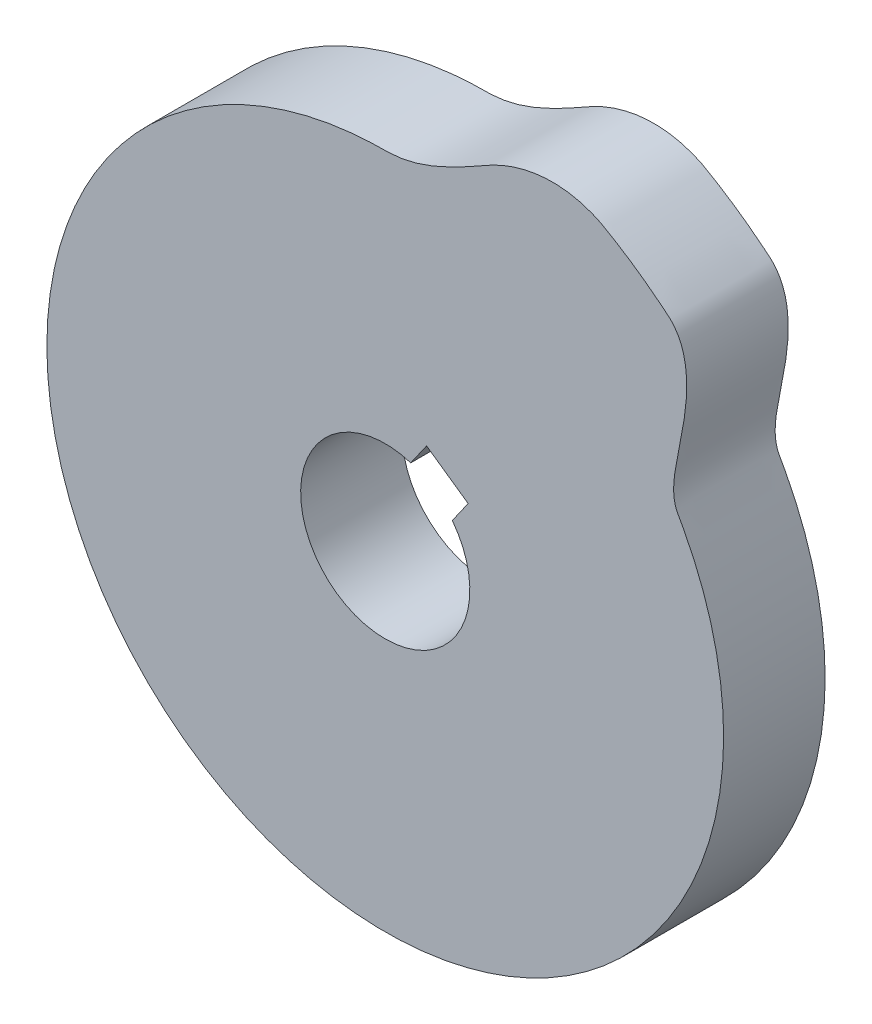
ISO-10303-21;
HEADER;
FILE_DESCRIPTION(('STEP AP214'),'2;1');
FILE_NAME('part.step','',(''),(''),'','','');
FILE_SCHEMA(('AUTOMOTIVE_DESIGN { 1 0 10303 214 1 1 1 1 }'));
ENDSEC;
DATA;
#1=APPLICATION_CONTEXT('core data for automotive mechanical design processes');
#2=APPLICATION_PROTOCOL_DEFINITION('international standard','automotive_design',2000,#1);
#3=PRODUCT_CONTEXT('',#1,'mechanical');
#4=PRODUCT('Part','Part','',(#3));
#5=PRODUCT_RELATED_PRODUCT_CATEGORY('part','',(#4));
#6=PRODUCT_DEFINITION_FORMATION('','',#4);
#7=PRODUCT_DEFINITION_CONTEXT('part definition',#1,'design');
#8=PRODUCT_DEFINITION('design','',#6,#7);
#9=PRODUCT_DEFINITION_SHAPE('','',#8);
#10=(LENGTH_UNIT() NAMED_UNIT(*) SI_UNIT(.MILLI.,.METRE.));
#11=(NAMED_UNIT(*) PLANE_ANGLE_UNIT() SI_UNIT($,.RADIAN.));
#12=(NAMED_UNIT(*) SI_UNIT($,.STERADIAN.) SOLID_ANGLE_UNIT());
#13=UNCERTAINTY_MEASURE_WITH_UNIT(LENGTH_MEASURE(1.E-05),#10,'distance_accuracy_value','');
#14=(GEOMETRIC_REPRESENTATION_CONTEXT(3) GLOBAL_UNCERTAINTY_ASSIGNED_CONTEXT((#13)) GLOBAL_UNIT_ASSIGNED_CONTEXT((#10,
#11,#12)) REPRESENTATION_CONTEXT('',''));
#15=CARTESIAN_POINT('',(0.,0.,0.));
#16=DIRECTION('',(0.,0.,1.));
#17=DIRECTION('',(1.,0.,0.));
#18=AXIS2_PLACEMENT_3D('',#15,#16,#17);
#19=CARTESIAN_POINT('',(-20.4615325185937,-34.3704187782246,12.));
#20=DIRECTION('',(0.,0.,1.));
#21=DIRECTION('',(1.,0.,0.));
#22=AXIS2_PLACEMENT_3D('',#19,#20,#21);
#23=PLANE('',#22);
#24=CARTESIAN_POINT('',(27.351788267644,44.2253284731948,12.));
#25=CARTESIAN_POINT('',(27.1931830429581,44.3234201476609,12.));
#26=CARTESIAN_POINT('',(26.874917235541,44.5178970796033,12.));
#27=CARTESIAN_POINT('',(26.3943448832861,44.8044963702247,12.));
#28=CARTESIAN_POINT('',(26.0719680807481,44.992079947368,12.));
#29=CARTESIAN_POINT('',(25.9102798104762,45.0850019423625,12.));
#30=CARTESIAN_POINT('',(25.7666668137713,45.1675361060252,12.));
#31=CARTESIAN_POINT('',(25.4786521116071,45.3312320461753,12.));
#32=CARTESIAN_POINT('',(25.0263100752025,45.5410170253763,12.));
#33=CARTESIAN_POINT('',(24.7225148507991,45.6733112667028,12.));
#34=CARTESIAN_POINT('',(24.5693142242955,45.7362886359156,12.));
#35=CARTESIAN_POINT('',(24.500615486571,45.7645291586136,12.));
#36=CARTESIAN_POINT('',(24.1486297754229,45.9054195878392,12.));
#37=CARTESIAN_POINT('',(23.4998149017966,46.1301547808238,12.));
#38=CARTESIAN_POINT('',(22.6079561920923,46.3656618421867,12.));
#39=CARTESIAN_POINT('',(21.6925330586667,46.5356784028058,12.));
#40=CARTESIAN_POINT('',(20.7564308154284,46.6390930460574,12.));
#41=CARTESIAN_POINT('',(19.8025690526918,46.6748886771731,12.));
#42=CARTESIAN_POINT('',(18.8338993754837,46.6421490697562,12.));
#43=CARTESIAN_POINT('',(17.853404897449,46.5400524704584,12.));
#44=CARTESIAN_POINT('',(16.8640862755001,46.367892076313,12.));
#45=CARTESIAN_POINT('',(15.8690024660056,46.1249993635437,12.));
#46=CARTESIAN_POINT('',(14.8711012043807,45.8110394708018,12.));
#47=CARTESIAN_POINT('',(13.8738602057386,45.4248740255938,12.));
#48=CARTESIAN_POINT('',(12.8788004550631,44.9689516213643,12.));
#49=CARTESIAN_POINT('',(11.9060560533204,44.4383261847397,12.));
#50=CARTESIAN_POINT('',(10.9563776069495,43.8878865770447,12.));
#51=CARTESIAN_POINT('',(10.0257220609132,43.3714696064802,12.));
#52=CARTESIAN_POINT('',(9.12876985688208,42.8861859173922,12.));
#53=CARTESIAN_POINT('',(8.2615996967004,42.4358063582141,12.));
#54=CARTESIAN_POINT('',(7.42217967019699,42.0207328607829,12.));
#55=CARTESIAN_POINT('',(6.6079609704187,41.6421075590876,12.));
#56=CARTESIAN_POINT('',(5.81648657571885,41.3007815925118,12.));
#57=CARTESIAN_POINT('',(5.04524338817252,40.997575808521,12.));
#58=CARTESIAN_POINT('',(4.29170589369962,40.73321644489,12.));
#59=CARTESIAN_POINT('',(3.55333298391446,40.508352574395,12.));
#60=CARTESIAN_POINT('',(2.82757854480692,40.3235483423924,12.));
#61=CARTESIAN_POINT('',(2.30179887798916,40.2175673720358,12.));
#62=CARTESIAN_POINT('',(2.01871004189042,40.1699451235539,12.));
#63=CARTESIAN_POINT('',(1.97501068572763,40.162820075087,12.));
#64=CARTESIAN_POINT('',(1.52579688274788,40.0895771168543,12.));
#65=CARTESIAN_POINT('',(0.619782199846999,39.9896242701687,12.));
#66=CARTESIAN_POINT('',(-0.751104888086971,40.0007194379671,12.));
#67=CARTESIAN_POINT('',(-1.66094397619508,39.9680925574346,12.));
#68=CARTESIAN_POINT('',(-2.11545267771183,39.9440215798104,12.));
#69=CARTESIAN_POINT('',(-51.8018720926637,37.3126072945147,12.));
#70=CARTESIAN_POINT('',(-62.8505970591826,-11.2012081814256,12.));
#71=CARTESIAN_POINT('',(-19.2036998230267,-35.0887148967739,12.));
#72=CARTESIAN_POINT('',(24.4431974131292,-58.9762216121223,12.));
#73=CARTESIAN_POINT('',(59.3504585177276,-23.5199423714186,12.));
#74=CARTESIAN_POINT('',(34.7847836199959,19.748894361712,12.));
#75=CARTESIAN_POINT('',(34.7538149178673,19.8034411926792,12.));
#76=CARTESIAN_POINT('',(34.6916209051342,19.9123891663799,12.));
#77=CARTESIAN_POINT('',(34.5965626736092,20.0750102148542,12.));
#78=CARTESIAN_POINT('',(34.5393063137751,20.1866822094049,12.));
#79=CARTESIAN_POINT('',(34.512190789136,20.2432433763275,12.));
#80=CARTESIAN_POINT('',(34.3443320142513,20.5933855296529,12.));
#81=CARTESIAN_POINT('',(34.1609296198581,21.2260381357472,12.));
#82=CARTESIAN_POINT('',(34.0788676304417,22.1660783425315,12.));
#83=CARTESIAN_POINT('',(34.1012454362837,23.0361300311325,12.));
#84=CARTESIAN_POINT('',(34.2006246787219,23.9782717238534,12.));
#85=CARTESIAN_POINT('',(34.3604741836044,24.9895471938373,12.));
#86=CARTESIAN_POINT('',(34.5633501353512,26.0641126342967,12.));
#87=CARTESIAN_POINT('',(34.790856262983,27.1934505635079,12.));
#88=CARTESIAN_POINT('',(35.0241100502253,28.3666511514612,12.));
#89=CARTESIAN_POINT('',(35.2442145328833,29.5707665040782,12.));
#90=CARTESIAN_POINT('',(35.432777549753,30.7911992313662,12.));
#91=CARTESIAN_POINT('',(35.5724027790772,32.0121334989225,12.));
#92=CARTESIAN_POINT('',(35.6471311412432,33.2170021224366,12.));
#93=CARTESIAN_POINT('',(35.6428087931816,34.3889784092053,12.));
#94=CARTESIAN_POINT('',(35.54733928896,35.5114576585555,12.));
#95=CARTESIAN_POINT('',(35.3508719526197,36.5684898849031,12.));
#96=CARTESIAN_POINT('',(35.0457326900832,37.5450084556567,12.));
#97=CARTESIAN_POINT('',(34.541053531558,38.6081466082314,12.));
#98=CARTESIAN_POINT('',(34.0276319446981,39.2754573486054,12.));
#99=CARTESIAN_POINT('',(33.6573732944792,39.6272547962542,12.));
#100=CARTESIAN_POINT('',(33.6360380689802,39.6475262412862,12.));
#101=CARTESIAN_POINT('',(33.5930031892293,39.6876855785445,12.));
#102=CARTESIAN_POINT('',(33.5280574590143,39.7476032157604,12.));
#103=CARTESIAN_POINT('',(33.4830340737501,39.7855161502201,12.));
#104=CARTESIAN_POINT('',(33.4605063044213,39.8044534926907,12.));
#105=CARTESIAN_POINT('',(33.4307583373565,39.8294602934925,12.));
#106=CARTESIAN_POINT('',(33.3712063365241,39.8794071984228,12.));
#107=CARTESIAN_POINT('',(33.2817100775072,39.9541275110499,12.));
#108=CARTESIAN_POINT('',(33.2219347077277,40.00380687581,12.));
#109=CARTESIAN_POINT('',(33.1920192144262,40.0286130220516,12.));
#110=CARTESIAN_POINT('',(31.3437218392584,41.5612347483339,12.));
#111=CARTESIAN_POINT('',(29.3938664802443,42.9623759338854,12.));
#112=CARTESIAN_POINT('',(27.351788267644,44.2253284731948,12.));
#113=(BOUNDED_CURVE() B_SPLINE_CURVE(3,(#24,#25,#26,#27,#28,#29,#30,#31,#32,#33,#34,#35,#36,#37,
#38,#39,#40,#41,#42,#43,#44,#45,#46,#47,#48,#49,#50,#51,#52,#53,#54,#55,#56,#57,#58,#59,#60,#61,
#62,#63,#64,#65,#66,#67,#68,#69,#70,#71,#72,#73,#74,#75,#76,#77,#78,#79,#80,#81,#82,#83,#84,#85,
#86,#87,#88,#89,#90,#91,#92,#93,#94,#95,#96,#97,#98,#99,#100,#101,#102,#103,#104,#105,#106,#107,
#108,#109,#110,#111,#112),.UNSPECIFIED.,.T.,.F.) B_SPLINE_CURVE_WITH_KNOTS((4,1,1,3,1,1,3,1,1,1,
1,1,1,1,1,1,1,1,1,1,1,1,1,1,1,1,1,1,1,1,1,1,1,3,1,1,3,3,3,1,1,3,1,1,1,1,1,1,1,1,1,1,1,1,1,1,1,1,
1,3,1,1,3,1,1,3,4),(0.,0.00261783248170844,0.00523566496341688,0.00785349744512531,
0.010178680137337,0.0125038628295489,0.0148290455217606,0.0158717117273709,0.0201509685300619,
0.0244608840379068,0.0288114028179871,0.0332122459432377,0.0376728693023729,0.0422024298271411,
0.046809759938315,0.0515033500783247,0.0562913388425984,0.0611815099600309,0.0661812952079781,
0.071297782270378,0.0765377265438096,0.0817321738107445,0.0867108261753381,0.0914810615588995,
0.0960511054013298,0.100430155314211,0.104628515136518,0.108657733808263,0.112530741289397,
0.116261969732843,0.119867443653935,0.123364818836794,0.126773347731141,0.127394951818203,
0.133784820237695,0.140174688657188,0.14656455707668,0.506688099088807,0.866811641100933,
0.86769224726041,0.868572853419887,0.869453459579363,0.874904855893958,0.878621228556623,
0.882684157432837,0.887123519729727,0.891932329734209,0.897075579483271,0.902497891860212,
0.908129864339164,0.913893486048163,0.919707012544745,0.925489585771357,0.931165805127391,
0.936670401371629,0.941953113072514,0.946983758755503,0.951757231424138,0.956297569154524,
0.963467995712467,0.963881173547603,0.964294351382738,0.964707529217874,0.965253131423409,
0.965798733628943,0.966344335834477,1.),
.UNSPECIFIED.) CURVE() GEOMETRIC_REPRESENTATION_ITEM() RATIONAL_B_SPLINE_CURVE((1.,1.,1.,1.,1.,
1.,1.,1.,1.,1.,1.,1.,1.,1.,1.,1.,1.,1.,1.,1.,1.,1.,1.,1.,1.,1.,1.,1.,1.,1.,1.,1.,1.,1.,1.,1.,1.,
1.,1.,1.,1.,1.,1.,1.,1.,0.515542055670003,0.515542055670003,1.,0.515542055670003,
0.515542055670003,1.,1.,1.,1.,1.,1.,1.,1.,1.,1.,1.,1.,1.,1.,1.,1.,1.,1.,1.,1.,1.,1.,1.,1.,1.,1.,
1.,1.,1.,1.,1.,1.,1.,1.,1.,1.,0.998404132864347,0.998404132864347,1.)) REPRESENTATION_ITEM(''));
#114=CARTESIAN_POINT('',(27.351788267644,44.2253284731948,12.));
#115=VERTEX_POINT('',#114);
#116=EDGE_CURVE('E121',#115,#115,#113,.T.);
#117=ORIENTED_EDGE('',*,*,#116,.T.);
#118=EDGE_LOOP('',(#117));
#119=FACE_BOUND('',#118,.T.);
#120=DIRECTION('',(0.573576436351046,0.819152044288992,0.));
#121=VECTOR('',#120,1.);
#122=CARTESIAN_POINT('',(9.79923449081011,8.76441681878575,12.));
#123=LINE('',#122,#121);
#124=CARTESIAN_POINT('',(7.92902660930992,6.09348316062786,12.));
#125=VERTEX_POINT('',#124);
#126=CARTESIAN_POINT('',(9.79923449081011,8.76441681878575,12.));
#127=VERTEX_POINT('',#126);
#128=EDGE_CURVE('E95',#125,#127,#123,.T.);
#129=ORIENTED_EDGE('',*,*,#128,.F.);
#130=CARTESIAN_POINT('',(0.,0.,12.));
#131=DIRECTION('',(0.,0.,1.));
#132=DIRECTION('',(1.,0.,0.));
#133=AXIS2_PLACEMENT_3D('',#130,#131,#132);
#134=CIRCLE('',#133,10.);
#135=CARTESIAN_POINT('',(3.01411434357597,9.53494177873413,12.));
#136=VERTEX_POINT('',#135);
#137=EDGE_CURVE('E86',#136,#125,#134,.T.);
#138=ORIENTED_EDGE('',*,*,#137,.F.);
#139=DIRECTION('',(-0.573576436351046,-0.819152044288992,0.));
#140=VECTOR('',#139,1.);
#141=CARTESIAN_POINT('',(3.01411434357597,9.53494177873413,12.));
#142=LINE('',#141,#140);
#143=CARTESIAN_POINT('',(4.88432222507616,12.205875436892,12.));
#144=VERTEX_POINT('',#143);
#145=EDGE_CURVE('E111',#144,#136,#142,.T.);
#146=ORIENTED_EDGE('',*,*,#145,.F.);
#147=DIRECTION('',(-0.819152044288992,0.573576436351046,0.));
#148=VECTOR('',#147,1.);
#149=CARTESIAN_POINT('',(4.88432222507616,12.205875436892,12.));
#150=LINE('',#149,#148);
#151=EDGE_CURVE('E107',#127,#144,#150,.T.);
#152=ORIENTED_EDGE('',*,*,#151,.F.);
#153=EDGE_LOOP('',(#129,#138,#146,#152));
#154=FACE_BOUND('',#153,.T.);
#155=ADVANCED_FACE('F45',(#119,#154),#23,.T.);
#156=CARTESIAN_POINT('',(-20.4615325185937,-34.3704187782246,0.));
#157=DIRECTION('',(0.,0.,1.));
#158=DIRECTION('',(1.,0.,0.));
#159=AXIS2_PLACEMENT_3D('',#156,#157,#158);
#160=PLANE('',#159);
#161=CARTESIAN_POINT('',(27.351788267644,44.2253284731948,0.));
#162=CARTESIAN_POINT('',(27.1931830429581,44.3234201476609,0.));
#163=CARTESIAN_POINT('',(26.874917235541,44.5178970796033,0.));
#164=CARTESIAN_POINT('',(26.3943448832861,44.8044963702247,0.));
#165=CARTESIAN_POINT('',(26.0719680807481,44.992079947368,0.));
#166=CARTESIAN_POINT('',(25.9102798104762,45.0850019423625,0.));
#167=CARTESIAN_POINT('',(25.7666668137713,45.1675361060252,0.));
#168=CARTESIAN_POINT('',(25.4786521116071,45.3312320461753,0.));
#169=CARTESIAN_POINT('',(25.0263100752025,45.5410170253763,0.));
#170=CARTESIAN_POINT('',(24.7225148507991,45.6733112667028,0.));
#171=CARTESIAN_POINT('',(24.5693142242955,45.7362886359156,0.));
#172=CARTESIAN_POINT('',(24.500615486571,45.7645291586136,0.));
#173=CARTESIAN_POINT('',(24.1486297754229,45.9054195878392,0.));
#174=CARTESIAN_POINT('',(23.4998149017966,46.1301547808238,0.));
#175=CARTESIAN_POINT('',(22.6079561920923,46.3656618421867,0.));
#176=CARTESIAN_POINT('',(21.6925330586667,46.5356784028058,0.));
#177=CARTESIAN_POINT('',(20.7564308154284,46.6390930460574,0.));
#178=CARTESIAN_POINT('',(19.8025690526918,46.6748886771731,0.));
#179=CARTESIAN_POINT('',(18.8338993754837,46.6421490697562,0.));
#180=CARTESIAN_POINT('',(17.853404897449,46.5400524704584,0.));
#181=CARTESIAN_POINT('',(16.8640862755001,46.367892076313,0.));
#182=CARTESIAN_POINT('',(15.8690024660056,46.1249993635437,0.));
#183=CARTESIAN_POINT('',(14.8711012043807,45.8110394708018,0.));
#184=CARTESIAN_POINT('',(13.8738602057386,45.4248740255938,0.));
#185=CARTESIAN_POINT('',(12.8788004550631,44.9689516213643,0.));
#186=CARTESIAN_POINT('',(11.9060560533204,44.4383261847397,0.));
#187=CARTESIAN_POINT('',(10.9563776069495,43.8878865770447,0.));
#188=CARTESIAN_POINT('',(10.0257220609132,43.3714696064802,0.));
#189=CARTESIAN_POINT('',(9.12876985688208,42.8861859173922,0.));
#190=CARTESIAN_POINT('',(8.2615996967004,42.4358063582141,0.));
#191=CARTESIAN_POINT('',(7.42217967019699,42.0207328607829,0.));
#192=CARTESIAN_POINT('',(6.6079609704187,41.6421075590876,0.));
#193=CARTESIAN_POINT('',(5.81648657571885,41.3007815925118,0.));
#194=CARTESIAN_POINT('',(5.04524338817252,40.997575808521,0.));
#195=CARTESIAN_POINT('',(4.29170589369962,40.73321644489,0.));
#196=CARTESIAN_POINT('',(3.55333298391446,40.508352574395,0.));
#197=CARTESIAN_POINT('',(2.82757854480692,40.3235483423924,0.));
#198=CARTESIAN_POINT('',(2.30179887798916,40.2175673720358,0.));
#199=CARTESIAN_POINT('',(2.01871004189042,40.1699451235539,0.));
#200=CARTESIAN_POINT('',(1.97501068572763,40.162820075087,0.));
#201=CARTESIAN_POINT('',(1.52579688274788,40.0895771168543,0.));
#202=CARTESIAN_POINT('',(0.619782199846999,39.9896242701687,0.));
#203=CARTESIAN_POINT('',(-0.751104888086971,40.0007194379671,0.));
#204=CARTESIAN_POINT('',(-1.66094397619508,39.9680925574346,0.));
#205=CARTESIAN_POINT('',(-2.11545267771183,39.9440215798104,0.));
#206=CARTESIAN_POINT('',(-51.8018720926637,37.3126072945147,0.));
#207=CARTESIAN_POINT('',(-62.8505970591826,-11.2012081814256,0.));
#208=CARTESIAN_POINT('',(-19.2036998230267,-35.0887148967739,0.));
#209=CARTESIAN_POINT('',(24.4431974131292,-58.9762216121223,0.));
#210=CARTESIAN_POINT('',(59.3504585177276,-23.5199423714186,0.));
#211=CARTESIAN_POINT('',(34.7847836199959,19.748894361712,0.));
#212=CARTESIAN_POINT('',(34.7538149178673,19.8034411926792,0.));
#213=CARTESIAN_POINT('',(34.6916209051342,19.9123891663799,0.));
#214=CARTESIAN_POINT('',(34.5965626736092,20.0750102148542,0.));
#215=CARTESIAN_POINT('',(34.5393063137751,20.1866822094049,0.));
#216=CARTESIAN_POINT('',(34.512190789136,20.2432433763275,0.));
#217=CARTESIAN_POINT('',(34.3443320142513,20.5933855296529,0.));
#218=CARTESIAN_POINT('',(34.1609296198581,21.2260381357472,0.));
#219=CARTESIAN_POINT('',(34.0788676304417,22.1660783425315,0.));
#220=CARTESIAN_POINT('',(34.1012454362837,23.0361300311325,0.));
#221=CARTESIAN_POINT('',(34.2006246787219,23.9782717238534,0.));
#222=CARTESIAN_POINT('',(34.3604741836044,24.9895471938373,0.));
#223=CARTESIAN_POINT('',(34.5633501353512,26.0641126342967,0.));
#224=CARTESIAN_POINT('',(34.790856262983,27.1934505635079,0.));
#225=CARTESIAN_POINT('',(35.0241100502253,28.3666511514612,0.));
#226=CARTESIAN_POINT('',(35.2442145328833,29.5707665040782,0.));
#227=CARTESIAN_POINT('',(35.432777549753,30.7911992313662,0.));
#228=CARTESIAN_POINT('',(35.5724027790772,32.0121334989225,0.));
#229=CARTESIAN_POINT('',(35.6471311412432,33.2170021224366,0.));
#230=CARTESIAN_POINT('',(35.6428087931816,34.3889784092053,0.));
#231=CARTESIAN_POINT('',(35.54733928896,35.5114576585555,0.));
#232=CARTESIAN_POINT('',(35.3508719526197,36.5684898849031,0.));
#233=CARTESIAN_POINT('',(35.0457326900832,37.5450084556567,0.));
#234=CARTESIAN_POINT('',(34.541053531558,38.6081466082314,0.));
#235=CARTESIAN_POINT('',(34.0276319446981,39.2754573486054,0.));
#236=CARTESIAN_POINT('',(33.6573732944792,39.6272547962542,0.));
#237=CARTESIAN_POINT('',(33.6360380689802,39.6475262412862,0.));
#238=CARTESIAN_POINT('',(33.5930031892293,39.6876855785445,0.));
#239=CARTESIAN_POINT('',(33.5280574590143,39.7476032157604,0.));
#240=CARTESIAN_POINT('',(33.4830340737501,39.7855161502201,0.));
#241=CARTESIAN_POINT('',(33.4605063044213,39.8044534926907,0.));
#242=CARTESIAN_POINT('',(33.4307583373565,39.8294602934925,0.));
#243=CARTESIAN_POINT('',(33.3712063365241,39.8794071984228,0.));
#244=CARTESIAN_POINT('',(33.2817100775072,39.9541275110499,0.));
#245=CARTESIAN_POINT('',(33.2219347077277,40.00380687581,0.));
#246=CARTESIAN_POINT('',(33.1920192144262,40.0286130220516,0.));
#247=CARTESIAN_POINT('',(31.3437218392584,41.5612347483339,0.));
#248=CARTESIAN_POINT('',(29.3938664802443,42.9623759338854,0.));
#249=CARTESIAN_POINT('',(27.351788267644,44.2253284731948,0.));
#250=(BOUNDED_CURVE() B_SPLINE_CURVE(3,(#161,#162,#163,#164,#165,#166,#167,#168,#169,#170,#171,
#172,#173,#174,#175,#176,#177,#178,#179,#180,#181,#182,#183,#184,#185,#186,#187,#188,#189,#190,
#191,#192,#193,#194,#195,#196,#197,#198,#199,#200,#201,#202,#203,#204,#205,#206,#207,#208,#209,
#210,#211,#212,#213,#214,#215,#216,#217,#218,#219,#220,#221,#222,#223,#224,#225,#226,#227,#228,
#229,#230,#231,#232,#233,#234,#235,#236,#237,#238,#239,#240,#241,#242,#243,#244,#245,#246,#247,
#248,#249),.UNSPECIFIED.,.T.,.F.) B_SPLINE_CURVE_WITH_KNOTS((4,1,1,3,1,1,3,1,1,1,1,1,1,1,1,1,1,
1,1,1,1,1,1,1,1,1,1,1,1,1,1,1,1,3,1,1,3,3,3,1,1,3,1,1,1,1,1,1,1,1,1,1,1,1,1,1,1,1,1,3,1,1,3,1,1,
3,4),(0.,0.00261783248170844,0.00523566496341688,0.00785349744512531,0.010178680137337,
0.0125038628295489,0.0148290455217606,0.0158717117273709,0.0201509685300619,0.0244608840379068,
0.0288114028179871,0.0332122459432377,0.0376728693023729,0.0422024298271411,0.046809759938315,
0.0515033500783247,0.0562913388425984,0.0611815099600309,0.0661812952079781,0.071297782270378,
0.0765377265438096,0.0817321738107445,0.0867108261753381,0.0914810615588995,0.0960511054013298,
0.100430155314211,0.104628515136518,0.108657733808263,0.112530741289397,0.116261969732843,
0.119867443653935,0.123364818836794,0.126773347731141,0.127394951818203,0.133784820237695,
0.140174688657188,0.14656455707668,0.506688099088807,0.866811641100933,0.86769224726041,
0.868572853419887,0.869453459579363,0.874904855893958,0.878621228556623,0.882684157432837,
0.887123519729727,0.891932329734209,0.897075579483271,0.902497891860212,0.908129864339164,
0.913893486048163,0.919707012544745,0.925489585771357,0.931165805127391,0.936670401371629,
0.941953113072514,0.946983758755503,0.951757231424138,0.956297569154524,0.963467995712467,
0.963881173547603,0.964294351382738,0.964707529217874,0.965253131423409,0.965798733628943,
0.966344335834477,1.),
.UNSPECIFIED.) CURVE() GEOMETRIC_REPRESENTATION_ITEM() RATIONAL_B_SPLINE_CURVE((1.,1.,1.,1.,1.,
1.,1.,1.,1.,1.,1.,1.,1.,1.,1.,1.,1.,1.,1.,1.,1.,1.,1.,1.,1.,1.,1.,1.,1.,1.,1.,1.,1.,1.,1.,1.,1.,
1.,1.,1.,1.,1.,1.,1.,1.,0.515542055670003,0.515542055670003,1.,0.515542055670003,
0.515542055670003,1.,1.,1.,1.,1.,1.,1.,1.,1.,1.,1.,1.,1.,1.,1.,1.,1.,1.,1.,1.,1.,1.,1.,1.,1.,1.,
1.,1.,1.,1.,1.,1.,1.,1.,1.,1.,0.998404132864347,0.998404132864347,1.)) REPRESENTATION_ITEM(''));
#251=CARTESIAN_POINT('',(27.351788267644,44.2253284731948,0.));
#252=VERTEX_POINT('',#251);
#253=EDGE_CURVE('E103',#252,#252,#250,.T.);
#254=ORIENTED_EDGE('',*,*,#253,.F.);
#255=EDGE_LOOP('',(#254));
#256=FACE_BOUND('',#255,.T.);
#257=CARTESIAN_POINT('',(0.,0.,0.));
#258=DIRECTION('',(0.,0.,1.));
#259=DIRECTION('',(1.,0.,0.));
#260=AXIS2_PLACEMENT_3D('',#257,#258,#259);
#261=CIRCLE('',#260,10.);
#262=CARTESIAN_POINT('',(7.92902660930992,6.09348316062786,0.));
#263=VERTEX_POINT('',#262);
#264=CARTESIAN_POINT('',(3.01411434357597,9.53494177873413,0.));
#265=VERTEX_POINT('',#264);
#266=EDGE_CURVE('E11',#263,#265,#261,.F.);
#267=ORIENTED_EDGE('',*,*,#266,.F.);
#268=DIRECTION('',(-0.573576436351046,-0.819152044288992,0.));
#269=VECTOR('',#268,1.);
#270=CARTESIAN_POINT('',(-20.4229964337033,-34.3974020353579,0.));
#271=LINE('',#270,#269);
#272=CARTESIAN_POINT('',(9.79923449081011,8.76441681878575,0.));
#273=VERTEX_POINT('',#272);
#274=EDGE_CURVE('E55',#273,#263,#271,.T.);
#275=ORIENTED_EDGE('',*,*,#274,.F.);
#276=DIRECTION('',(0.819152044288992,-0.573576436351046,0.));
#277=VECTOR('',#276,1.);
#278=CARTESIAN_POINT('',(9.76069840591968,8.7914000759191,0.));
#279=LINE('',#278,#277);
#280=CARTESIAN_POINT('',(4.88432222507616,12.205875436892,0.));
#281=VERTEX_POINT('',#280);
#282=EDGE_CURVE('E142',#281,#273,#279,.T.);
#283=ORIENTED_EDGE('',*,*,#282,.F.);
#284=DIRECTION('',(0.573576436351046,0.819152044288992,0.));
#285=VECTOR('',#284,1.);
#286=CARTESIAN_POINT('',(-25.3379086994372,-30.9559434172517,0.));
#287=LINE('',#286,#285);
#288=EDGE_CURVE('E128',#265,#281,#287,.T.);
#289=ORIENTED_EDGE('',*,*,#288,.F.);
#290=EDGE_LOOP('',(#267,#275,#283,#289));
#291=FACE_BOUND('',#290,.T.);
#292=ADVANCED_FACE('F150',(#256,#291),#160,.F.);
#293=DIRECTION('',(0.,0.,-1.));
#294=VECTOR('',#293,1.);
#295=SURFACE_OF_LINEAR_EXTRUSION('',#113,#294);
#296=ORIENTED_EDGE('',*,*,#116,.F.);
#297=EDGE_LOOP('',(#296));
#298=FACE_BOUND('',#297,.T.);
#299=ORIENTED_EDGE('',*,*,#253,.T.);
#300=EDGE_LOOP('',(#299));
#301=FACE_BOUND('',#300,.T.);
#302=ADVANCED_FACE('F47',(#298,#301),#295,.F.);
#303=CARTESIAN_POINT('',(0.,0.,12.));
#304=DIRECTION('',(0.,0.,-1.));
#305=DIRECTION('',(-1.,0.,0.));
#306=AXIS2_PLACEMENT_3D('',#303,#304,#305);
#307=CYLINDRICAL_SURFACE('',#306,10.);
#308=ORIENTED_EDGE('',*,*,#266,.T.);
#309=DIRECTION('',(0.,0.,-1.));
#310=VECTOR('',#309,1.);
#311=CARTESIAN_POINT('',(3.01411434357597,9.53494177873413,12.));
#312=LINE('',#311,#310);
#313=EDGE_CURVE('E67',#136,#265,#312,.T.);
#314=ORIENTED_EDGE('',*,*,#313,.F.);
#315=ORIENTED_EDGE('',*,*,#137,.T.);
#316=DIRECTION('',(0.,0.,-1.));
#317=VECTOR('',#316,1.);
#318=CARTESIAN_POINT('',(7.92902660930992,6.09348316062786,12.));
#319=LINE('',#318,#317);
#320=EDGE_CURVE('E89',#125,#263,#319,.T.);
#321=ORIENTED_EDGE('',*,*,#320,.T.);
#322=EDGE_LOOP('',(#308,#314,#315,#321));
#323=FACE_BOUND('',#322,.T.);
#324=ADVANCED_FACE('F88',(#323),#307,.F.);
#325=CARTESIAN_POINT('',(9.79923449081011,8.76441681878575,12.));
#326=DIRECTION('',(-0.819152044288992,0.573576436351046,0.));
#327=DIRECTION('',(-0.573576436351046,-0.819152044288992,0.));
#328=AXIS2_PLACEMENT_3D('',#325,#326,#327);
#329=PLANE('',#328);
#330=ORIENTED_EDGE('',*,*,#274,.T.);
#331=ORIENTED_EDGE('',*,*,#320,.F.);
#332=ORIENTED_EDGE('',*,*,#128,.T.);
#333=DIRECTION('',(0.,0.,-1.));
#334=VECTOR('',#333,1.);
#335=CARTESIAN_POINT('',(9.79923449081011,8.76441681878575,12.));
#336=LINE('',#335,#334);
#337=EDGE_CURVE('E104',#127,#273,#336,.T.);
#338=ORIENTED_EDGE('',*,*,#337,.T.);
#339=EDGE_LOOP('',(#330,#331,#332,#338));
#340=FACE_BOUND('',#339,.T.);
#341=ADVANCED_FACE('F98',(#340),#329,.T.);
#342=CARTESIAN_POINT('',(4.88432222507616,12.205875436892,12.));
#343=DIRECTION('',(-0.573576436351046,-0.819152044288992,0.));
#344=DIRECTION('',(0.819152044288992,-0.573576436351046,0.));
#345=AXIS2_PLACEMENT_3D('',#342,#343,#344);
#346=PLANE('',#345);
#347=ORIENTED_EDGE('',*,*,#282,.T.);
#348=ORIENTED_EDGE('',*,*,#337,.F.);
#349=ORIENTED_EDGE('',*,*,#151,.T.);
#350=DIRECTION('',(0.,0.,-1.));
#351=VECTOR('',#350,1.);
#352=CARTESIAN_POINT('',(4.88432222507616,12.205875436892,12.));
#353=LINE('',#352,#351);
#354=EDGE_CURVE('E62',#144,#281,#353,.T.);
#355=ORIENTED_EDGE('',*,*,#354,.T.);
#356=EDGE_LOOP('',(#347,#348,#349,#355));
#357=FACE_BOUND('',#356,.T.);
#358=ADVANCED_FACE('F147',(#357),#346,.T.);
#359=CARTESIAN_POINT('',(3.01411434357597,9.53494177873413,12.));
#360=DIRECTION('',(0.819152044288992,-0.573576436351046,0.));
#361=DIRECTION('',(0.573576436351046,0.819152044288992,0.));
#362=AXIS2_PLACEMENT_3D('',#359,#360,#361);
#363=PLANE('',#362);
#364=ORIENTED_EDGE('',*,*,#288,.T.);
#365=ORIENTED_EDGE('',*,*,#354,.F.);
#366=ORIENTED_EDGE('',*,*,#145,.T.);
#367=ORIENTED_EDGE('',*,*,#313,.T.);
#368=EDGE_LOOP('',(#364,#365,#366,#367));
#369=FACE_BOUND('',#368,.T.);
#370=ADVANCED_FACE('F151',(#369),#363,.T.);
#371=CLOSED_SHELL('',(#155,#292,#302,#324,#341,#358,#370));
#372=MANIFOLD_SOLID_BREP('B2',#371);
#373=ADVANCED_BREP_SHAPE_REPRESENTATION('',(#18,#372),#14);
#374=SHAPE_DEFINITION_REPRESENTATION(#9,#373);
ENDSEC;
END-ISO-10303-21;
